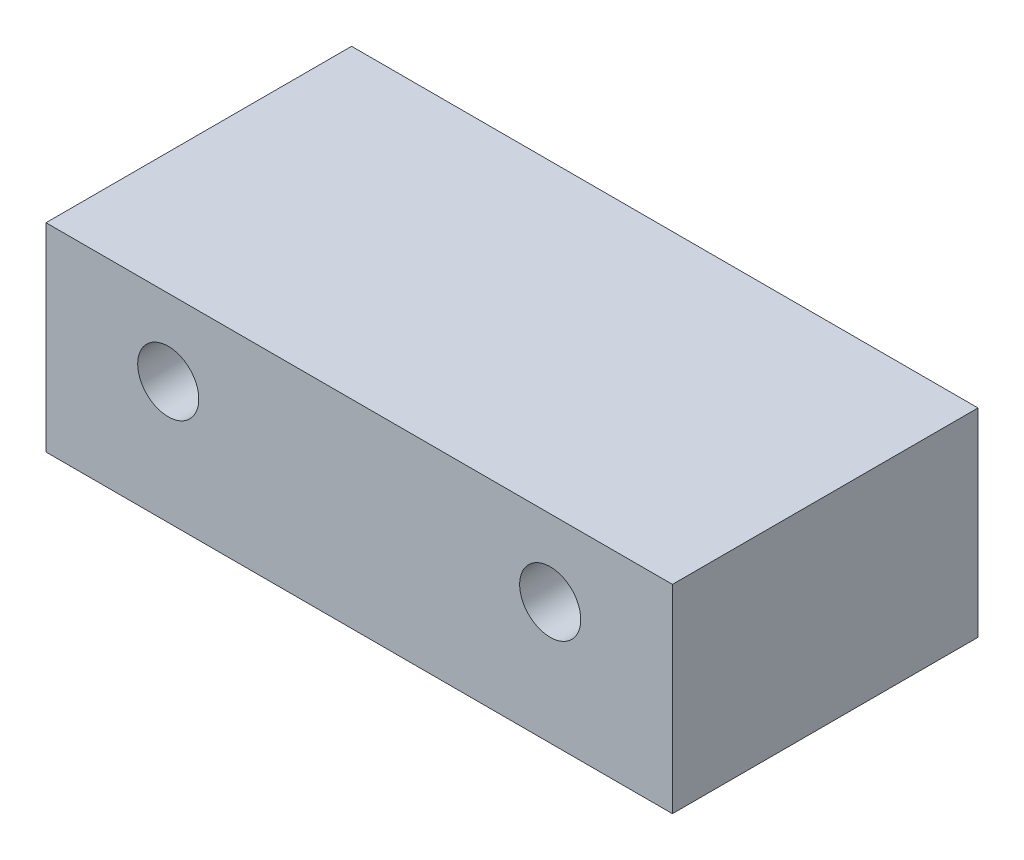
ISO-10303-21;
HEADER;
FILE_DESCRIPTION(('STEP AP214'),'2;1');
FILE_NAME('part.step','',(''),(''),'','','');
FILE_SCHEMA(('AUTOMOTIVE_DESIGN { 1 0 10303 214 1 1 1 1 }'));
ENDSEC;
DATA;
#1=APPLICATION_CONTEXT('core data for automotive mechanical design processes');
#2=APPLICATION_PROTOCOL_DEFINITION('international standard','automotive_design',2000,#1);
#3=PRODUCT_CONTEXT('',#1,'mechanical');
#4=PRODUCT('Part','Part','',(#3));
#5=PRODUCT_RELATED_PRODUCT_CATEGORY('part','',(#4));
#6=PRODUCT_DEFINITION_FORMATION('','',#4);
#7=PRODUCT_DEFINITION_CONTEXT('part definition',#1,'design');
#8=PRODUCT_DEFINITION('design','',#6,#7);
#9=PRODUCT_DEFINITION_SHAPE('','',#8);
#10=(LENGTH_UNIT() NAMED_UNIT(*) SI_UNIT(.MILLI.,.METRE.));
#11=(NAMED_UNIT(*) PLANE_ANGLE_UNIT() SI_UNIT($,.RADIAN.));
#12=(NAMED_UNIT(*) SI_UNIT($,.STERADIAN.) SOLID_ANGLE_UNIT());
#13=UNCERTAINTY_MEASURE_WITH_UNIT(LENGTH_MEASURE(1.E-05),#10,'distance_accuracy_value','');
#14=(GEOMETRIC_REPRESENTATION_CONTEXT(3) GLOBAL_UNCERTAINTY_ASSIGNED_CONTEXT((#13)) GLOBAL_UNIT_ASSIGNED_CONTEXT((#10,
#11,#12)) REPRESENTATION_CONTEXT('',''));
#15=CARTESIAN_POINT('',(0.,0.,0.));
#16=DIRECTION('',(0.,0.,1.));
#17=DIRECTION('',(1.,0.,0.));
#18=AXIS2_PLACEMENT_3D('',#15,#16,#17);
#19=CARTESIAN_POINT('',(0.,0.,20.));
#20=DIRECTION('',(0.,0.,-1.));
#21=DIRECTION('',(-1.,0.,0.));
#22=AXIS2_PLACEMENT_3D('',#19,#20,#21);
#23=PLANE('',#22);
#24=DIRECTION('',(0.,1.,0.));
#25=VECTOR('',#24,1.);
#26=CARTESIAN_POINT('',(20.5,-5.,20.));
#27=LINE('',#26,#25);
#28=CARTESIAN_POINT('',(20.5,-8.,20.));
#29=VERTEX_POINT('',#28);
#30=CARTESIAN_POINT('',(20.5,5.,20.));
#31=VERTEX_POINT('',#30);
#32=EDGE_CURVE('E103',#29,#31,#27,.T.);
#33=ORIENTED_EDGE('',*,*,#32,.T.);
#34=DIRECTION('',(-1.,0.,0.));
#35=VECTOR('',#34,1.);
#36=CARTESIAN_POINT('',(-20.5,5.,20.));
#37=LINE('',#36,#35);
#38=CARTESIAN_POINT('',(-20.5,5.,20.));
#39=VERTEX_POINT('',#38);
#40=EDGE_CURVE('E61',#31,#39,#37,.T.);
#41=ORIENTED_EDGE('',*,*,#40,.T.);
#42=DIRECTION('',(0.,-1.,0.));
#43=VECTOR('',#42,1.);
#44=CARTESIAN_POINT('',(-20.5,-5.,20.));
#45=LINE('',#44,#43);
#46=CARTESIAN_POINT('',(-20.5,-8.,20.));
#47=VERTEX_POINT('',#46);
#48=EDGE_CURVE('E77',#39,#47,#45,.T.);
#49=ORIENTED_EDGE('',*,*,#48,.T.);
#50=DIRECTION('',(1.,0.,0.));
#51=VECTOR('',#50,1.);
#52=CARTESIAN_POINT('',(-20.5,-8.,20.));
#53=LINE('',#52,#51);
#54=EDGE_CURVE('E109',#47,#29,#53,.T.);
#55=ORIENTED_EDGE('',*,*,#54,.T.);
#56=EDGE_LOOP('',(#33,#41,#49,#55));
#57=FACE_BOUND('',#56,.T.);
#58=CARTESIAN_POINT('',(12.5,0.,20.));
#59=DIRECTION('',(0.,0.,1.));
#60=DIRECTION('',(1.,0.,0.));
#61=AXIS2_PLACEMENT_3D('',#58,#59,#60);
#62=CIRCLE('',#61,2.);
#63=CARTESIAN_POINT('',(14.5,0.,20.));
#64=VERTEX_POINT('',#63);
#65=EDGE_CURVE('E99',#64,#64,#62,.T.);
#66=ORIENTED_EDGE('',*,*,#65,.F.);
#67=EDGE_LOOP('',(#66));
#68=FACE_BOUND('',#67,.T.);
#69=CARTESIAN_POINT('',(-12.5,0.,20.));
#70=DIRECTION('',(0.,0.,1.));
#71=DIRECTION('',(-1.,0.,0.));
#72=AXIS2_PLACEMENT_3D('',#69,#70,#71);
#73=CIRCLE('',#72,2.);
#74=CARTESIAN_POINT('',(-14.5,0.,20.));
#75=VERTEX_POINT('',#74);
#76=EDGE_CURVE('E115',#75,#75,#73,.T.);
#77=ORIENTED_EDGE('',*,*,#76,.F.);
#78=EDGE_LOOP('',(#77));
#79=FACE_BOUND('',#78,.T.);
#80=ADVANCED_FACE('F44',(#57,#68,#79),#23,.F.);
#81=CARTESIAN_POINT('',(0.,0.,0.));
#82=DIRECTION('',(0.,0.,-1.));
#83=DIRECTION('',(-1.,0.,0.));
#84=AXIS2_PLACEMENT_3D('',#81,#82,#83);
#85=PLANE('',#84);
#86=CARTESIAN_POINT('',(12.5,0.,0.));
#87=DIRECTION('',(0.,0.,1.));
#88=DIRECTION('',(1.,0.,0.));
#89=AXIS2_PLACEMENT_3D('',#86,#87,#88);
#90=CIRCLE('',#89,2.);
#91=CARTESIAN_POINT('',(14.5,0.,0.));
#92=VERTEX_POINT('',#91);
#93=EDGE_CURVE('E118',#92,#92,#90,.T.);
#94=ORIENTED_EDGE('',*,*,#93,.T.);
#95=EDGE_LOOP('',(#94));
#96=FACE_BOUND('',#95,.T.);
#97=DIRECTION('',(0.,1.,0.));
#98=VECTOR('',#97,1.);
#99=CARTESIAN_POINT('',(20.5,-5.,0.));
#100=LINE('',#99,#98);
#101=CARTESIAN_POINT('',(20.5,-8.,0.));
#102=VERTEX_POINT('',#101);
#103=CARTESIAN_POINT('',(20.5,5.,0.));
#104=VERTEX_POINT('',#103);
#105=EDGE_CURVE('E90',#102,#104,#100,.T.);
#106=ORIENTED_EDGE('',*,*,#105,.F.);
#107=DIRECTION('',(1.,0.,0.));
#108=VECTOR('',#107,1.);
#109=CARTESIAN_POINT('',(-20.5,-8.,0.));
#110=LINE('',#109,#108);
#111=CARTESIAN_POINT('',(-20.5,-8.,0.));
#112=VERTEX_POINT('',#111);
#113=EDGE_CURVE('E95',#112,#102,#110,.T.);
#114=ORIENTED_EDGE('',*,*,#113,.F.);
#115=DIRECTION('',(0.,-1.,0.));
#116=VECTOR('',#115,1.);
#117=CARTESIAN_POINT('',(-20.5,-5.,0.));
#118=LINE('',#117,#116);
#119=CARTESIAN_POINT('',(-20.5,5.,0.));
#120=VERTEX_POINT('',#119);
#121=EDGE_CURVE('E87',#120,#112,#118,.T.);
#122=ORIENTED_EDGE('',*,*,#121,.F.);
#123=DIRECTION('',(-1.,0.,0.));
#124=VECTOR('',#123,1.);
#125=CARTESIAN_POINT('',(-20.5,5.,0.));
#126=LINE('',#125,#124);
#127=EDGE_CURVE('E72',#104,#120,#126,.T.);
#128=ORIENTED_EDGE('',*,*,#127,.F.);
#129=EDGE_LOOP('',(#106,#114,#122,#128));
#130=FACE_BOUND('',#129,.T.);
#131=CARTESIAN_POINT('',(-12.5,0.,0.));
#132=DIRECTION('',(0.,0.,1.));
#133=DIRECTION('',(-1.,0.,0.));
#134=AXIS2_PLACEMENT_3D('',#131,#132,#133);
#135=CIRCLE('',#134,2.);
#136=CARTESIAN_POINT('',(-14.5,0.,0.));
#137=VERTEX_POINT('',#136);
#138=EDGE_CURVE('E114',#137,#137,#135,.T.);
#139=ORIENTED_EDGE('',*,*,#138,.T.);
#140=EDGE_LOOP('',(#139));
#141=FACE_BOUND('',#140,.T.);
#142=ADVANCED_FACE('F92',(#96,#130,#141),#85,.T.);
#143=CARTESIAN_POINT('',(20.5,-5.,20.));
#144=DIRECTION('',(-1.,0.,0.));
#145=DIRECTION('',(0.,0.,1.));
#146=AXIS2_PLACEMENT_3D('',#143,#144,#145);
#147=PLANE('',#146);
#148=ORIENTED_EDGE('',*,*,#105,.T.);
#149=DIRECTION('',(0.,0.,-1.));
#150=VECTOR('',#149,1.);
#151=CARTESIAN_POINT('',(20.5,5.,20.));
#152=LINE('',#151,#150);
#153=EDGE_CURVE('E11',#31,#104,#152,.T.);
#154=ORIENTED_EDGE('',*,*,#153,.F.);
#155=ORIENTED_EDGE('',*,*,#32,.F.);
#156=DIRECTION('',(0.,0.,1.));
#157=VECTOR('',#156,1.);
#158=CARTESIAN_POINT('',(20.5,-8.,-41.1096095821889));
#159=LINE('',#158,#157);
#160=EDGE_CURVE('E102',#102,#29,#159,.T.);
#161=ORIENTED_EDGE('',*,*,#160,.F.);
#162=EDGE_LOOP('',(#148,#154,#155,#161));
#163=FACE_BOUND('',#162,.T.);
#164=ADVANCED_FACE('F46',(#163),#147,.F.);
#165=CARTESIAN_POINT('',(-20.5,5.,20.));
#166=DIRECTION('',(0.,-1.,0.));
#167=DIRECTION('',(0.,0.,-1.));
#168=AXIS2_PLACEMENT_3D('',#165,#166,#167);
#169=PLANE('',#168);
#170=ORIENTED_EDGE('',*,*,#127,.T.);
#171=DIRECTION('',(0.,0.,-1.));
#172=VECTOR('',#171,1.);
#173=CARTESIAN_POINT('',(-20.5,5.,20.));
#174=LINE('',#173,#172);
#175=EDGE_CURVE('E53',#39,#120,#174,.T.);
#176=ORIENTED_EDGE('',*,*,#175,.F.);
#177=ORIENTED_EDGE('',*,*,#40,.F.);
#178=ORIENTED_EDGE('',*,*,#153,.T.);
#179=EDGE_LOOP('',(#170,#176,#177,#178));
#180=FACE_BOUND('',#179,.T.);
#181=ADVANCED_FACE('F131',(#180),#169,.F.);
#182=CARTESIAN_POINT('',(-20.5,-5.,20.));
#183=DIRECTION('',(1.,0.,0.));
#184=DIRECTION('',(0.,0.,-1.));
#185=AXIS2_PLACEMENT_3D('',#182,#183,#184);
#186=PLANE('',#185);
#187=ORIENTED_EDGE('',*,*,#121,.T.);
#188=DIRECTION('',(0.,0.,1.));
#189=VECTOR('',#188,1.);
#190=CARTESIAN_POINT('',(-20.5,-8.,-41.1096095821889));
#191=LINE('',#190,#189);
#192=EDGE_CURVE('E106',#112,#47,#191,.T.);
#193=ORIENTED_EDGE('',*,*,#192,.T.);
#194=ORIENTED_EDGE('',*,*,#48,.F.);
#195=ORIENTED_EDGE('',*,*,#175,.T.);
#196=EDGE_LOOP('',(#187,#193,#194,#195));
#197=FACE_BOUND('',#196,.T.);
#198=ADVANCED_FACE('F129',(#197),#186,.F.);
#199=CARTESIAN_POINT('',(12.5,0.,20.));
#200=DIRECTION('',(0.,0.,-1.));
#201=DIRECTION('',(-1.,0.,0.));
#202=AXIS2_PLACEMENT_3D('',#199,#200,#201);
#203=CYLINDRICAL_SURFACE('',#202,2.);
#204=ORIENTED_EDGE('',*,*,#65,.T.);
#205=EDGE_LOOP('',(#204));
#206=FACE_BOUND('',#205,.T.);
#207=ORIENTED_EDGE('',*,*,#93,.F.);
#208=EDGE_LOOP('',(#207));
#209=FACE_BOUND('',#208,.T.);
#210=ADVANCED_FACE('F142',(#206,#209),#203,.F.);
#211=CARTESIAN_POINT('',(-12.5,0.,20.));
#212=DIRECTION('',(0.,0.,-1.));
#213=DIRECTION('',(-1.,0.,0.));
#214=AXIS2_PLACEMENT_3D('',#211,#212,#213);
#215=CYLINDRICAL_SURFACE('',#214,2.);
#216=ORIENTED_EDGE('',*,*,#76,.T.);
#217=EDGE_LOOP('',(#216));
#218=FACE_BOUND('',#217,.T.);
#219=ORIENTED_EDGE('',*,*,#138,.F.);
#220=EDGE_LOOP('',(#219));
#221=FACE_BOUND('',#220,.T.);
#222=ADVANCED_FACE('F139',(#218,#221),#215,.F.);
#223=CARTESIAN_POINT('',(-20.5,-8.,-41.1096095821889));
#224=DIRECTION('',(0.,-1.,0.));
#225=DIRECTION('',(0.,0.,-1.));
#226=AXIS2_PLACEMENT_3D('',#223,#224,#225);
#227=PLANE('',#226);
#228=ORIENTED_EDGE('',*,*,#192,.F.);
#229=ORIENTED_EDGE('',*,*,#113,.T.);
#230=ORIENTED_EDGE('',*,*,#160,.T.);
#231=ORIENTED_EDGE('',*,*,#54,.F.);
#232=EDGE_LOOP('',(#228,#229,#230,#231));
#233=FACE_BOUND('',#232,.T.);
#234=ADVANCED_FACE('F108',(#233),#227,.T.);
#235=CLOSED_SHELL('',(#80,#142,#164,#181,#198,#210,#222,#234));
#236=MANIFOLD_SOLID_BREP('B2',#235);
#237=ADVANCED_BREP_SHAPE_REPRESENTATION('',(#18,#236),#14);
#238=SHAPE_DEFINITION_REPRESENTATION(#9,#237);
ENDSEC;
END-ISO-10303-21;
